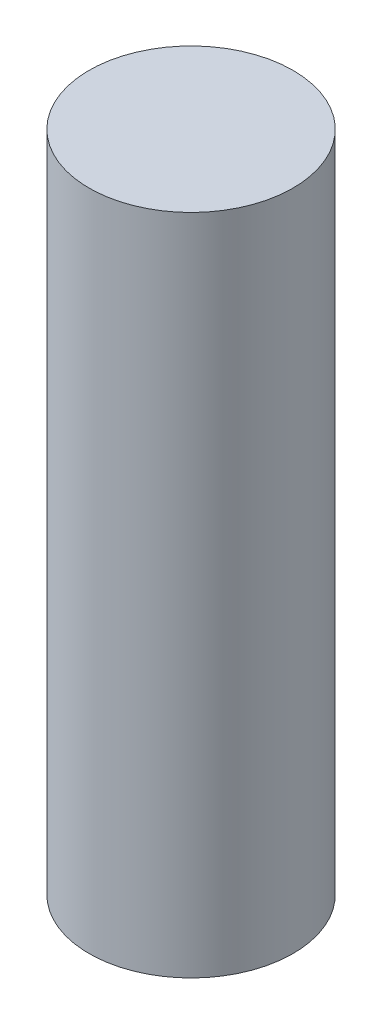
ISO-10303-21;
HEADER;
FILE_DESCRIPTION(('STEP AP214'),'2;1');
FILE_NAME('part.step','',(''),(''),'','','');
FILE_SCHEMA(('AUTOMOTIVE_DESIGN { 1 0 10303 214 1 1 1 1 }'));
ENDSEC;
DATA;
#1=APPLICATION_CONTEXT('core data for automotive mechanical design processes');
#2=APPLICATION_PROTOCOL_DEFINITION('international standard','automotive_design',2000,#1);
#3=PRODUCT_CONTEXT('',#1,'mechanical');
#4=PRODUCT('Part','Part','',(#3));
#5=PRODUCT_RELATED_PRODUCT_CATEGORY('part','',(#4));
#6=PRODUCT_DEFINITION_FORMATION('','',#4);
#7=PRODUCT_DEFINITION_CONTEXT('part definition',#1,'design');
#8=PRODUCT_DEFINITION('design','',#6,#7);
#9=PRODUCT_DEFINITION_SHAPE('','',#8);
#10=(LENGTH_UNIT() NAMED_UNIT(*) SI_UNIT(.MILLI.,.METRE.));
#11=(NAMED_UNIT(*) PLANE_ANGLE_UNIT() SI_UNIT($,.RADIAN.));
#12=(NAMED_UNIT(*) SI_UNIT($,.STERADIAN.) SOLID_ANGLE_UNIT());
#13=UNCERTAINTY_MEASURE_WITH_UNIT(LENGTH_MEASURE(1.E-05),#10,'distance_accuracy_value','');
#14=(GEOMETRIC_REPRESENTATION_CONTEXT(3) GLOBAL_UNCERTAINTY_ASSIGNED_CONTEXT((#13)) GLOBAL_UNIT_ASSIGNED_CONTEXT((#10,
#11,#12)) REPRESENTATION_CONTEXT('',''));
#15=CARTESIAN_POINT('',(0.,0.,0.));
#16=DIRECTION('',(0.,0.,1.));
#17=DIRECTION('',(1.,0.,0.));
#18=AXIS2_PLACEMENT_3D('',#15,#16,#17);
#19=CARTESIAN_POINT('',(0.,6.5,0.));
#20=DIRECTION('',(0.,-1.,0.));
#21=DIRECTION('',(0.,0.,-1.));
#22=AXIS2_PLACEMENT_3D('',#19,#20,#21);
#23=CYLINDRICAL_SURFACE('',#22,1.);
#24=CARTESIAN_POINT('',(0.,6.5,0.));
#25=DIRECTION('',(0.,1.,0.));
#26=DIRECTION('',(0.,0.,1.));
#27=AXIS2_PLACEMENT_3D('',#24,#25,#26);
#28=CIRCLE('',#27,1.);
#29=CARTESIAN_POINT('',(0.,6.5,-1.));
#30=VERTEX_POINT('',#29);
#31=EDGE_CURVE('E10',#30,#30,#28,.T.);
#32=CARTESIAN_POINT('',(0.,0.,0.));
#33=DIRECTION('',(0.,1.,0.));
#34=DIRECTION('',(0.,0.,1.));
#35=AXIS2_PLACEMENT_3D('',#32,#33,#34);
#36=CIRCLE('',#35,1.);
#37=CARTESIAN_POINT('',(0.,0.,-1.));
#38=VERTEX_POINT('',#37);
#39=EDGE_CURVE('E34',#38,#38,#36,.T.);
#40=CARTESIAN_POINT('',(0.,6.5,-1.));
#41=CARTESIAN_POINT('',(0.,6.43229166666667,-1.));
#42=CARTESIAN_POINT('',(0.,6.36458333333333,-1.));
#43=CARTESIAN_POINT('',(0.,6.22916666666667,-1.));
#44=CARTESIAN_POINT('',(0.,6.16145833333333,-1.));
#45=CARTESIAN_POINT('',(0.,6.02604166666667,-1.));
#46=CARTESIAN_POINT('',(0.,5.95833333333333,-1.));
#47=CARTESIAN_POINT('',(0.,5.82291666666667,-1.));
#48=CARTESIAN_POINT('',(0.,5.75520833333333,-1.));
#49=CARTESIAN_POINT('',(0.,5.61979166666667,-1.));
#50=CARTESIAN_POINT('',(0.,5.55208333333333,-1.));
#51=CARTESIAN_POINT('',(0.,5.41666666666667,-1.));
#52=CARTESIAN_POINT('',(0.,5.34895833333333,-1.));
#53=CARTESIAN_POINT('',(0.,5.21354166666667,-1.));
#54=CARTESIAN_POINT('',(0.,5.14583333333333,-1.));
#55=CARTESIAN_POINT('',(0.,5.01041666666667,-1.));
#56=CARTESIAN_POINT('',(0.,4.94270833333333,-1.));
#57=CARTESIAN_POINT('',(0.,4.80729166666667,-1.));
#58=CARTESIAN_POINT('',(0.,4.73958333333333,-1.));
#59=CARTESIAN_POINT('',(0.,4.60416666666667,-1.));
#60=CARTESIAN_POINT('',(0.,4.53645833333333,-1.));
#61=CARTESIAN_POINT('',(0.,4.40104166666667,-1.));
#62=CARTESIAN_POINT('',(0.,4.33333333333333,-1.));
#63=CARTESIAN_POINT('',(0.,4.19791666666667,-1.));
#64=CARTESIAN_POINT('',(0.,4.13020833333333,-1.));
#65=CARTESIAN_POINT('',(0.,3.99479166666667,-1.));
#66=CARTESIAN_POINT('',(0.,3.92708333333333,-1.));
#67=CARTESIAN_POINT('',(0.,3.79166666666667,-1.));
#68=CARTESIAN_POINT('',(0.,3.72395833333333,-1.));
#69=CARTESIAN_POINT('',(0.,3.58854166666667,-1.));
#70=CARTESIAN_POINT('',(0.,3.52083333333333,-1.));
#71=CARTESIAN_POINT('',(0.,3.38541666666667,-1.));
#72=CARTESIAN_POINT('',(0.,3.31770833333333,-1.));
#73=CARTESIAN_POINT('',(0.,3.18229166666667,-1.));
#74=CARTESIAN_POINT('',(0.,3.11458333333333,-1.));
#75=CARTESIAN_POINT('',(0.,2.97916666666667,-1.));
#76=CARTESIAN_POINT('',(0.,2.91145833333333,-1.));
#77=CARTESIAN_POINT('',(0.,2.77604166666667,-1.));
#78=CARTESIAN_POINT('',(0.,2.70833333333333,-1.));
#79=CARTESIAN_POINT('',(0.,2.57291666666667,-1.));
#80=CARTESIAN_POINT('',(0.,2.50520833333333,-1.));
#81=CARTESIAN_POINT('',(0.,2.36979166666667,-1.));
#82=CARTESIAN_POINT('',(0.,2.30208333333333,-1.));
#83=CARTESIAN_POINT('',(0.,2.16666666666667,-1.));
#84=CARTESIAN_POINT('',(0.,2.09895833333333,-1.));
#85=CARTESIAN_POINT('',(0.,1.96354166666667,-1.));
#86=CARTESIAN_POINT('',(0.,1.89583333333333,-1.));
#87=CARTESIAN_POINT('',(0.,1.76041666666667,-1.));
#88=CARTESIAN_POINT('',(0.,1.69270833333333,-1.));
#89=CARTESIAN_POINT('',(0.,1.55729166666667,-1.));
#90=CARTESIAN_POINT('',(0.,1.48958333333333,-1.));
#91=CARTESIAN_POINT('',(0.,1.35416666666667,-1.));
#92=CARTESIAN_POINT('',(0.,1.28645833333333,-1.));
#93=CARTESIAN_POINT('',(0.,1.15104166666667,-1.));
#94=CARTESIAN_POINT('',(0.,1.08333333333333,-1.));
#95=CARTESIAN_POINT('',(0.,0.947916666666667,-1.));
#96=CARTESIAN_POINT('',(0.,0.880208333333333,-1.));
#97=CARTESIAN_POINT('',(0.,0.744791666666667,-1.));
#98=CARTESIAN_POINT('',(0.,0.677083333333333,-1.));
#99=CARTESIAN_POINT('',(0.,0.541666666666667,-1.));
#100=CARTESIAN_POINT('',(0.,0.473958333333333,-1.));
#101=CARTESIAN_POINT('',(0.,0.338541666666667,-1.));
#102=CARTESIAN_POINT('',(0.,0.270833333333334,-1.));
#103=CARTESIAN_POINT('',(0.,0.135416666666667,-1.));
#104=CARTESIAN_POINT('',(0.,0.0677083333333334,-1.));
#105=CARTESIAN_POINT('',(0.,0.,-1.));
#106=B_SPLINE_CURVE_WITH_KNOTS('',3,(#40,#41,#42,#43,#44,#45,#46,#47,#48,#49,#50,#51,#52,#53,
#54,#55,#56,#57,#58,#59,#60,#61,#62,#63,#64,#65,#66,#67,#68,#69,#70,#71,#72,#73,#74,#75,#76,#77,
#78,#79,#80,#81,#82,#83,#84,#85,#86,#87,#88,#89,#90,#91,#92,#93,#94,#95,#96,#97,#98,#99,#100,
#101,#102,#103,#104,#105),.UNSPECIFIED.,.F.,.F.,(4,2,2,2,2,2,2,2,2,2,2,2,2,2,2,2,2,2,2,2,2,2,2,
2,2,2,2,2,2,2,2,2,4),(0.,0.203125,0.40625,0.609375000000001,0.812500000000001,1.015625,1.21875,
1.421875,1.625,1.828125,2.03125,2.234375,2.4375,2.640625,2.84375,3.046875,3.25,3.453125,3.65625,
3.859375,4.0625,4.265625,4.46875,4.671875,4.875,5.078125,5.28125,5.484375,5.6875,5.890625,
6.09375,6.296875,6.5),.UNSPECIFIED.);
#107=EDGE_CURVE('BSEAM31',#30,#38,#106,.T.);
#108=ORIENTED_EDGE('',*,*,#31,.F.);
#109=ORIENTED_EDGE('',*,*,#39,.T.);
#110=ORIENTED_EDGE('',*,*,#107,.T.);
#111=ORIENTED_EDGE('',*,*,#107,.F.);
#112=EDGE_LOOP('',(#108,#110,#109,#111));
#113=FACE_BOUND('',#112,.T.);
#114=ADVANCED_FACE('F31',(#113),#23,.T.);
#115=CARTESIAN_POINT('',(0.,6.5,0.));
#116=DIRECTION('',(0.,1.,0.));
#117=DIRECTION('',(0.,0.,1.));
#118=AXIS2_PLACEMENT_3D('',#115,#116,#117);
#119=PLANE('',#118);
#120=ORIENTED_EDGE('',*,*,#31,.T.);
#121=EDGE_LOOP('',(#120));
#122=FACE_BOUND('',#121,.T.);
#123=ADVANCED_FACE('F46',(#122),#119,.T.);
#124=CARTESIAN_POINT('',(0.,0.,0.));
#125=DIRECTION('',(0.,1.,0.));
#126=DIRECTION('',(0.,0.,1.));
#127=AXIS2_PLACEMENT_3D('',#124,#125,#126);
#128=PLANE('',#127);
#129=ORIENTED_EDGE('',*,*,#39,.F.);
#130=EDGE_LOOP('',(#129));
#131=FACE_BOUND('',#130,.T.);
#132=ADVANCED_FACE('F44',(#131),#128,.F.);
#133=CLOSED_SHELL('',(#114,#123,#132));
#134=MANIFOLD_SOLID_BREP('B2',#133);
#135=ADVANCED_BREP_SHAPE_REPRESENTATION('',(#18,#134),#14);
#136=SHAPE_DEFINITION_REPRESENTATION(#9,#135);
ENDSEC;
END-ISO-10303-21;
